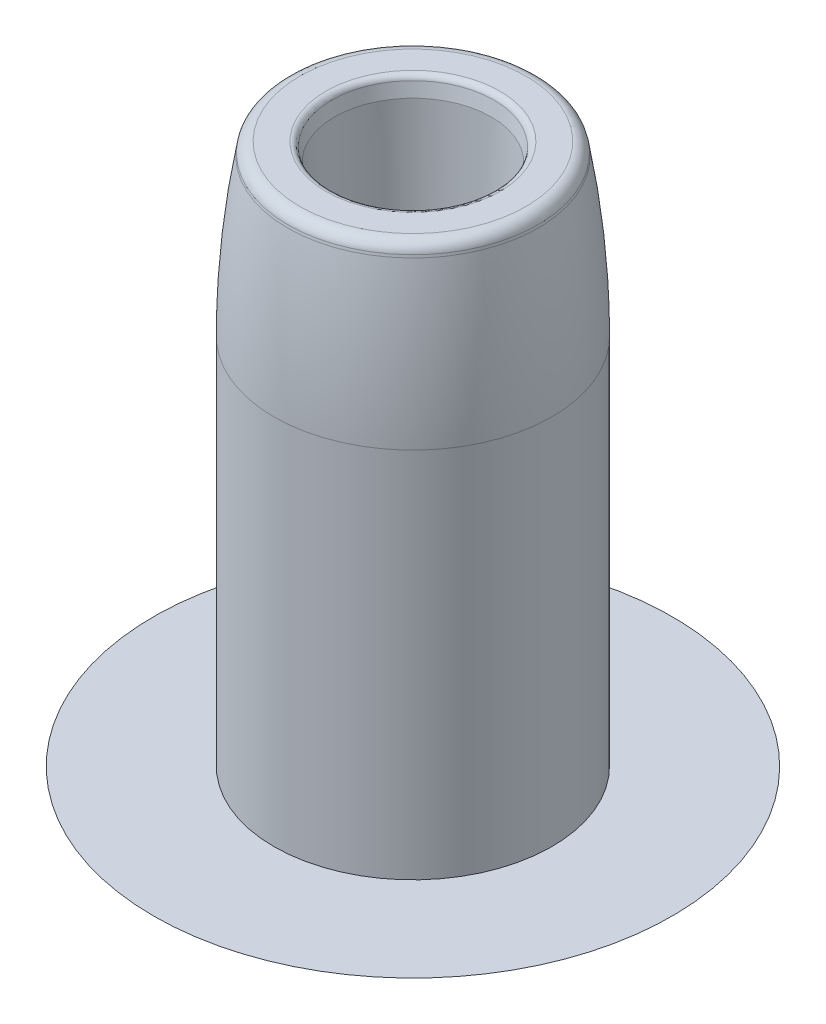
ISO-10303-21;
HEADER;
FILE_DESCRIPTION(('STEP AP214'),'2;1');
FILE_NAME('part.step','',(''),(''),'','','');
FILE_SCHEMA(('AUTOMOTIVE_DESIGN { 1 0 10303 214 1 1 1 1 }'));
ENDSEC;
DATA;
#1=APPLICATION_CONTEXT('core data for automotive mechanical design processes');
#2=APPLICATION_PROTOCOL_DEFINITION('international standard','automotive_design',2000,#1);
#3=PRODUCT_CONTEXT('',#1,'mechanical');
#4=PRODUCT('Part','Part','',(#3));
#5=PRODUCT_RELATED_PRODUCT_CATEGORY('part','',(#4));
#6=PRODUCT_DEFINITION_FORMATION('','',#4);
#7=PRODUCT_DEFINITION_CONTEXT('part definition',#1,'design');
#8=PRODUCT_DEFINITION('design','',#6,#7);
#9=PRODUCT_DEFINITION_SHAPE('','',#8);
#10=(LENGTH_UNIT() NAMED_UNIT(*) SI_UNIT(.MILLI.,.METRE.));
#11=(NAMED_UNIT(*) PLANE_ANGLE_UNIT() SI_UNIT($,.RADIAN.));
#12=(NAMED_UNIT(*) SI_UNIT($,.STERADIAN.) SOLID_ANGLE_UNIT());
#13=UNCERTAINTY_MEASURE_WITH_UNIT(LENGTH_MEASURE(1.E-05),#10,'distance_accuracy_value','');
#14=(GEOMETRIC_REPRESENTATION_CONTEXT(3) GLOBAL_UNCERTAINTY_ASSIGNED_CONTEXT((#13)) GLOBAL_UNIT_ASSIGNED_CONTEXT((#10,
#11,#12)) REPRESENTATION_CONTEXT('',''));
#15=CARTESIAN_POINT('',(0.,0.,0.));
#16=DIRECTION('',(0.,0.,1.));
#17=DIRECTION('',(1.,0.,0.));
#18=AXIS2_PLACEMENT_3D('',#15,#16,#17);
#19=CARTESIAN_POINT('',(0.,0.190500000000003,5.87142816539722));
#20=DIRECTION('',(0.,1.,0.));
#21=DIRECTION('',(0.,0.,1.));
#22=AXIS2_PLACEMENT_3D('',#19,#20,#21);
#23=PLANE('',#22);
#24=CARTESIAN_POINT('',(0.,0.190500000000004,0.));
#25=DIRECTION('',(0.,1.,0.));
#26=DIRECTION('',(0.,0.,1.));
#27=AXIS2_PLACEMENT_3D('',#24,#25,#26);
#28=CIRCLE('',#27,3.67378558890642);
#29=CARTESIAN_POINT('',(0.,0.190500000000003,3.67378558890643));
#30=VERTEX_POINT('',#29);
#31=EDGE_CURVE('E49',#30,#30,#28,.F.);
#32=ORIENTED_EDGE('',*,*,#31,.T.);
#33=EDGE_LOOP('',(#32));
#34=FACE_BOUND('',#33,.T.);
#35=CARTESIAN_POINT('',(0.,0.190500000000004,0.));
#36=DIRECTION('',(0.,1.,0.));
#37=DIRECTION('',(0.,0.,1.));
#38=AXIS2_PLACEMENT_3D('',#35,#36,#37);
#39=CIRCLE('',#38,4.7733597562599);
#40=CARTESIAN_POINT('',(0.,0.190500000000003,4.7733597562599));
#41=VERTEX_POINT('',#40);
#42=EDGE_CURVE('E66',#41,#41,#39,.T.);
#43=ORIENTED_EDGE('',*,*,#42,.T.);
#44=EDGE_LOOP('',(#43));
#45=FACE_BOUND('',#44,.T.);
#46=ADVANCED_FACE('F34',(#34,#45),#23,.T.);
#47=CARTESIAN_POINT('',(0.,-22.6695,0.));
#48=DIRECTION('',(0.,1.,0.));
#49=DIRECTION('',(0.,0.,1.));
#50=AXIS2_PLACEMENT_3D('',#47,#48,#49);
#51=CYLINDRICAL_SURFACE('',#50,5.87142816539722);
#52=CARTESIAN_POINT('',(0.,-6.95281808033783,0.));
#53=DIRECTION('',(0.,1.,0.));
#54=DIRECTION('',(0.,0.,1.));
#55=AXIS2_PLACEMENT_3D('',#52,#53,#54);
#56=CIRCLE('',#55,5.87142816539722);
#57=CARTESIAN_POINT('',(0.,-6.95281808033783,5.87142816539723));
#58=VERTEX_POINT('',#57);
#59=EDGE_CURVE('E60',#58,#58,#56,.F.);
#60=ORIENTED_EDGE('',*,*,#59,.T.);
#61=EDGE_LOOP('',(#60));
#62=FACE_BOUND('',#61,.T.);
#63=CARTESIAN_POINT('',(0.,-22.6695,0.));
#64=DIRECTION('',(0.,1.,0.));
#65=DIRECTION('',(0.,0.,1.));
#66=AXIS2_PLACEMENT_3D('',#63,#64,#65);
#67=CIRCLE('',#66,5.87142816539722);
#68=CARTESIAN_POINT('',(0.,-22.6695,5.87142816539722));
#69=VERTEX_POINT('',#68);
#70=EDGE_CURVE('E69',#69,#69,#67,.T.);
#71=ORIENTED_EDGE('',*,*,#70,.T.);
#72=EDGE_LOOP('',(#71));
#73=FACE_BOUND('',#72,.T.);
#74=ADVANCED_FACE('F94',(#62,#73),#51,.T.);
#75=CARTESIAN_POINT('',(0.,-22.6695,10.9514281653972));
#76=DIRECTION('',(0.,1.,0.));
#77=DIRECTION('',(0.,0.,1.));
#78=AXIS2_PLACEMENT_3D('',#75,#76,#77);
#79=PLANE('',#78);
#80=CARTESIAN_POINT('',(0.,-22.6695,0.));
#81=DIRECTION('',(0.,1.,0.));
#82=DIRECTION('',(0.,0.,1.));
#83=AXIS2_PLACEMENT_3D('',#80,#81,#82);
#84=CIRCLE('',#83,10.9514281653972);
#85=CARTESIAN_POINT('',(0.,-22.6695,10.9514281653972));
#86=VERTEX_POINT('',#85);
#87=EDGE_CURVE('E72',#86,#86,#84,.T.);
#88=ORIENTED_EDGE('',*,*,#87,.T.);
#89=EDGE_LOOP('',(#88));
#90=FACE_BOUND('',#89,.T.);
#91=ORIENTED_EDGE('',*,*,#70,.F.);
#92=EDGE_LOOP('',(#91));
#93=FACE_BOUND('',#92,.T.);
#94=ADVANCED_FACE('F90',(#90,#93),#79,.T.);
#95=CARTESIAN_POINT('',(0.,-22.6695,10.9514281653972));
#96=CARTESIAN_POINT('',(0.,-23.8785807896627,7.67361224045639));
#97=CARTESIAN_POINT('',(0.,-25.0577390321289,8.42469591227505));
#98=CARTESIAN_POINT('',(0.,-24.0396746341818,3.76086141109789));
#99=CARTESIAN_POINT('',(0.,-24.1935,1.09624609106894));
#100=CARTESIAN_POINT('',(0.,-24.1935,0.));
#101=B_SPLINE_CURVE_WITH_KNOTS('',3,(#95,#96,#97,#98,#99,#100),.UNSPECIFIED.,.F.,.F.,(4,1,1,4),
(0.,0.345230168279619,0.440287604798124,1.),.UNSPECIFIED.);
#102=CARTESIAN_POINT('',(0.,-22.6695,0.));
#103=DIRECTION('',(0.,1.,0.));
#104=AXIS1_PLACEMENT('',#102,#103);
#105=SURFACE_OF_REVOLUTION('',#101,#104);
#106=CARTESIAN_POINT('',(0.,-24.4012674125907,0.));
#107=DIRECTION('',(0.,1.,0.));
#108=DIRECTION('',(0.,0.,1.));
#109=AXIS2_PLACEMENT_3D('',#106,#107,#108);
#110=CIRCLE('',#109,5.1373265673773);
#111=CARTESIAN_POINT('',(0.,-24.4012674125907,5.1373265673773));
#112=VERTEX_POINT('',#111);
#113=EDGE_CURVE('E10',#112,#112,#110,.T.);
#114=ORIENTED_EDGE('',*,*,#113,.T.);
#115=EDGE_LOOP('',(#114));
#116=FACE_BOUND('',#115,.T.);
#117=ORIENTED_EDGE('',*,*,#87,.F.);
#118=EDGE_LOOP('',(#117));
#119=FACE_BOUND('',#118,.T.);
#120=ADVANCED_FACE('F85',(#116,#119),#105,.F.);
#121=CARTESIAN_POINT('',(0.,-22.6695,0.));
#122=DIRECTION('',(0.,1.,0.));
#123=DIRECTION('',(0.,0.,1.));
#124=AXIS2_PLACEMENT_3D('',#121,#122,#123);
#125=CYLINDRICAL_SURFACE('',#124,2.95042816539722);
#126=CARTESIAN_POINT('',(0.,-21.8859306038361,0.));
#127=DIRECTION('',(0.,1.,0.));
#128=DIRECTION('',(0.,0.,1.));
#129=AXIS2_PLACEMENT_3D('',#126,#127,#128);
#130=CIRCLE('',#129,2.95042816539722);
#131=CARTESIAN_POINT('',(0.,-21.8859306038361,2.95042816539722));
#132=VERTEX_POINT('',#131);
#133=EDGE_CURVE('E41',#132,#132,#130,.F.);
#134=ORIENTED_EDGE('',*,*,#133,.T.);
#135=EDGE_LOOP('',(#134));
#136=FACE_BOUND('',#135,.T.);
#137=CARTESIAN_POINT('',(0.,-13.7795,0.));
#138=DIRECTION('',(0.,1.,0.));
#139=DIRECTION('',(0.,0.,1.));
#140=AXIS2_PLACEMENT_3D('',#137,#138,#139);
#141=CIRCLE('',#140,2.95042816539722);
#142=CARTESIAN_POINT('',(0.,-13.7795,2.95042816539722));
#143=VERTEX_POINT('',#142);
#144=EDGE_CURVE('E75',#143,#143,#141,.T.);
#145=ORIENTED_EDGE('',*,*,#144,.T.);
#146=EDGE_LOOP('',(#145));
#147=FACE_BOUND('',#146,.T.);
#148=ADVANCED_FACE('F89',(#136,#147),#125,.F.);
#149=CARTESIAN_POINT('',(0.,-13.7795,0.));
#150=DIRECTION('',(0.,1.,0.));
#151=DIRECTION('',(0.,0.,1.));
#152=AXIS2_PLACEMENT_3D('',#149,#150,#151);
#153=CONICAL_SURFACE('',#152,2.95042816539722,0.0272659684555944);
#154=CARTESIAN_POINT('',(0.,-0.571216769560734,0.));
#155=DIRECTION('',(0.,-1.,0.));
#156=DIRECTION('',(0.,0.,-1.));
#157=AXIS2_PLACEMENT_3D('',#154,#155,#156);
#158=CIRCLE('',#157,3.31065407168193);
#159=CARTESIAN_POINT('',(0.,-0.571216769560734,-3.31065407168192));
#160=VERTEX_POINT('',#159);
#161=EDGE_CURVE('E54',#160,#160,#158,.F.);
#162=ORIENTED_EDGE('',*,*,#161,.T.);
#163=EDGE_LOOP('',(#162));
#164=FACE_BOUND('',#163,.T.);
#165=ORIENTED_EDGE('',*,*,#144,.F.);
#166=EDGE_LOOP('',(#165));
#167=FACE_BOUND('',#166,.T.);
#168=ADVANCED_FACE('F110',(#164,#167),#153,.F.);
#169=CARTESIAN_POINT('',(0.,0.190500000000003,0.));
#170=DIRECTION('',(0.,-1.,0.));
#171=DIRECTION('',(0.,0.,-1.));
#172=AXIS2_PLACEMENT_3D('',#169,#170,#171);
#173=CONICAL_SURFACE('',#172,5.19962236889796,0.17453292519943);
#174=CARTESIAN_POINT('',(0.,-0.336822511227911,0.));
#175=DIRECTION('',(0.,1.,0.));
#176=DIRECTION('',(0.,0.,1.));
#177=AXIS2_PLACEMENT_3D('',#174,#175,#176);
#178=CIRCLE('',#177,5.29260355516238);
#179=CARTESIAN_POINT('',(0.,-0.336822511227912,5.29260355516239));
#180=VERTEX_POINT('',#179);
#181=EDGE_CURVE('E57',#180,#180,#178,.T.);
#182=ORIENTED_EDGE('',*,*,#181,.T.);
#183=EDGE_LOOP('',(#182));
#184=FACE_BOUND('',#183,.T.);
#185=CARTESIAN_POINT('',(0.,-0.229286725745199,0.));
#186=DIRECTION('',(0.,1.,0.));
#187=DIRECTION('',(0.,0.,1.));
#188=AXIS2_PLACEMENT_3D('',#185,#186,#187);
#189=CIRCLE('',#188,5.2736420947901);
#190=CARTESIAN_POINT('',(0.,-0.229286725745199,5.27364209479011));
#191=VERTEX_POINT('',#190);
#192=EDGE_CURVE('E63',#191,#191,#189,.F.);
#193=ORIENTED_EDGE('',*,*,#192,.T.);
#194=EDGE_LOOP('',(#193));
#195=FACE_BOUND('',#194,.T.);
#196=ADVANCED_FACE('F103',(#184,#195),#173,.T.);
#197=CARTESIAN_POINT('',(0.,-0.317499999999996,0.));
#198=DIRECTION('',(0.,1.,0.));
#199=DIRECTION('',(0.,0.,1.));
#200=AXIS2_PLACEMENT_3D('',#197,#198,#199);
#201=TOROIDAL_SURFACE('',#200,4.7733597562599,0.508);
#202=ORIENTED_EDGE('',*,*,#192,.F.);
#203=EDGE_LOOP('',(#202));
#204=FACE_BOUND('',#203,.T.);
#205=ORIENTED_EDGE('',*,*,#42,.F.);
#206=EDGE_LOOP('',(#205));
#207=FACE_BOUND('',#206,.T.);
#208=ADVANCED_FACE('F109',(#204,#207),#201,.T.);
#209=CARTESIAN_POINT('',(0.,-6.95281808033783,0.));
#210=DIRECTION('',(0.,1.,0.));
#211=DIRECTION('',(0.,0.,1.));
#212=AXIS2_PLACEMENT_3D('',#209,#210,#211);
#213=DEGENERATE_TOROIDAL_SURFACE('',#212,32.2285718346028,38.1,.F.);
#214=ORIENTED_EDGE('',*,*,#181,.F.);
#215=EDGE_LOOP('',(#214));
#216=FACE_BOUND('',#215,.T.);
#217=ORIENTED_EDGE('',*,*,#59,.F.);
#218=EDGE_LOOP('',(#217));
#219=FACE_BOUND('',#218,.T.);
#220=ADVANCED_FACE('F114',(#216,#219),#213,.F.);
#221=CARTESIAN_POINT('',(0.,-0.571216769560731,0.));
#222=DIRECTION('',(0.,1.,0.));
#223=DIRECTION('',(0.,0.,1.));
#224=AXIS2_PLACEMENT_3D('',#221,#222,#223);
#225=CONICAL_SURFACE('',#224,3.31065407168193,0.201798893655025);
#226=CARTESIAN_POINT('',(0.,-0.0125902608382571,0.));
#227=DIRECTION('',(0.,-1.,0.));
#228=DIRECTION('',(0.,0.,-1.));
#229=AXIS2_PLACEMENT_3D('',#226,#227,#228);
#230=CIRCLE('',#229,3.42493985665754);
#231=CARTESIAN_POINT('',(0.,-0.0125902608382566,-3.42493985665753));
#232=VERTEX_POINT('',#231);
#233=EDGE_CURVE('E45',#232,#232,#230,.F.);
#234=ORIENTED_EDGE('',*,*,#233,.T.);
#235=EDGE_LOOP('',(#234));
#236=FACE_BOUND('',#235,.T.);
#237=ORIENTED_EDGE('',*,*,#161,.F.);
#238=EDGE_LOOP('',(#237));
#239=FACE_BOUND('',#238,.T.);
#240=ADVANCED_FACE('F118',(#236,#239),#225,.F.);
#241=CARTESIAN_POINT('',(0.,-0.0634999999999962,0.));
#242=DIRECTION('',(0.,1.,0.));
#243=DIRECTION('',(0.,0.,1.));
#244=AXIS2_PLACEMENT_3D('',#241,#242,#243);
#245=TOROIDAL_SURFACE('',#244,3.67378558890642,0.254);
#246=ORIENTED_EDGE('',*,*,#233,.F.);
#247=EDGE_LOOP('',(#246));
#248=FACE_BOUND('',#247,.T.);
#249=ORIENTED_EDGE('',*,*,#31,.F.);
#250=EDGE_LOOP('',(#249));
#251=FACE_BOUND('',#250,.T.);
#252=ADVANCED_FACE('F123',(#248,#251),#245,.T.);
#253=CARTESIAN_POINT('',(0.,-21.8859306038361,0.));
#254=DIRECTION('',(0.,1.,0.));
#255=DIRECTION('',(0.,0.,1.));
#256=AXIS2_PLACEMENT_3D('',#253,#254,#255);
#257=TOROIDAL_SURFACE('',#256,5.49042816539722,2.54);
#258=ORIENTED_EDGE('',*,*,#113,.F.);
#259=EDGE_LOOP('',(#258));
#260=FACE_BOUND('',#259,.T.);
#261=ORIENTED_EDGE('',*,*,#133,.F.);
#262=EDGE_LOOP('',(#261));
#263=FACE_BOUND('',#262,.T.);
#264=ADVANCED_FACE('F36',(#260,#263),#257,.T.);
#265=CLOSED_SHELL('',(#46,#74,#94,#120,#148,#168,#196,#208,#220,#240,#252,#264));
#266=MANIFOLD_SOLID_BREP('B2',#265);
#267=ADVANCED_BREP_SHAPE_REPRESENTATION('',(#18,#266),#14);
#268=SHAPE_DEFINITION_REPRESENTATION(#9,#267);
ENDSEC;
END-ISO-10303-21;
